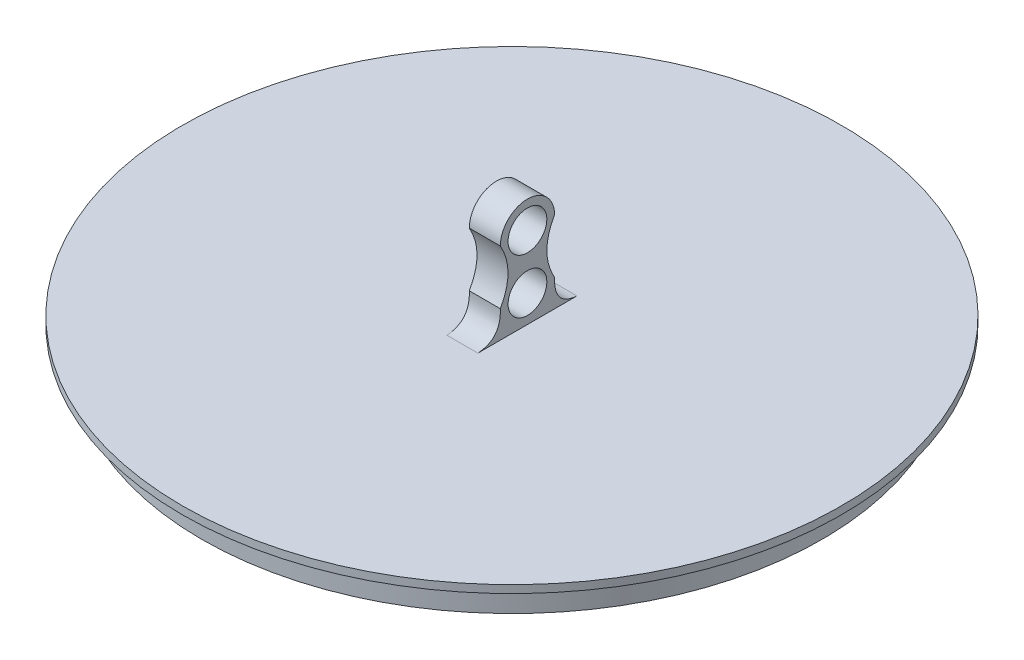
ISO-10303-21;
HEADER;
FILE_DESCRIPTION(('STEP AP214'),'2;1');
FILE_NAME('part.step','',(''),(''),'','','');
FILE_SCHEMA(('AUTOMOTIVE_DESIGN { 1 0 10303 214 1 1 1 1 }'));
ENDSEC;
DATA;
#1=APPLICATION_CONTEXT('core data for automotive mechanical design processes');
#2=APPLICATION_PROTOCOL_DEFINITION('international standard','automotive_design',2000,#1);
#3=PRODUCT_CONTEXT('',#1,'mechanical');
#4=PRODUCT('Part','Part','',(#3));
#5=PRODUCT_RELATED_PRODUCT_CATEGORY('part','',(#4));
#6=PRODUCT_DEFINITION_FORMATION('','',#4);
#7=PRODUCT_DEFINITION_CONTEXT('part definition',#1,'design');
#8=PRODUCT_DEFINITION('design','',#6,#7);
#9=PRODUCT_DEFINITION_SHAPE('','',#8);
#10=(LENGTH_UNIT() NAMED_UNIT(*) SI_UNIT(.MILLI.,.METRE.));
#11=(NAMED_UNIT(*) PLANE_ANGLE_UNIT() SI_UNIT($,.RADIAN.));
#12=(NAMED_UNIT(*) SI_UNIT($,.STERADIAN.) SOLID_ANGLE_UNIT());
#13=UNCERTAINTY_MEASURE_WITH_UNIT(LENGTH_MEASURE(1.E-05),#10,'distance_accuracy_value','');
#14=(GEOMETRIC_REPRESENTATION_CONTEXT(3) GLOBAL_UNCERTAINTY_ASSIGNED_CONTEXT((#13)) GLOBAL_UNIT_ASSIGNED_CONTEXT((#10,
#11,#12)) REPRESENTATION_CONTEXT('',''));
#15=CARTESIAN_POINT('',(0.,0.,0.));
#16=DIRECTION('',(0.,0.,1.));
#17=DIRECTION('',(1.,0.,0.));
#18=AXIS2_PLACEMENT_3D('',#15,#16,#17);
#19=CARTESIAN_POINT('',(0.,5.,0.));
#20=DIRECTION('',(0.,1.,0.));
#21=DIRECTION('',(0.,0.,1.));
#22=AXIS2_PLACEMENT_3D('',#19,#20,#21);
#23=PLANE('',#22);
#24=CARTESIAN_POINT('',(0.,5.,0.));
#25=DIRECTION('',(0.,1.,0.));
#26=DIRECTION('',(0.,0.,1.));
#27=AXIS2_PLACEMENT_3D('',#24,#25,#26);
#28=CIRCLE('',#27,42.5);
#29=CARTESIAN_POINT('',(0.,5.,42.5));
#30=VERTEX_POINT('',#29);
#31=EDGE_CURVE('E190',#30,#30,#28,.T.);
#32=ORIENTED_EDGE('',*,*,#31,.T.);
#33=EDGE_LOOP('',(#32));
#34=FACE_BOUND('',#33,.T.);
#35=DIRECTION('',(1.,0.,0.));
#36=VECTOR('',#35,1.);
#37=CARTESIAN_POINT('',(-2.,5.,6.38998179076283));
#38=LINE('',#37,#36);
#39=CARTESIAN_POINT('',(-2.,5.,6.38998179076284));
#40=VERTEX_POINT('',#39);
#41=CARTESIAN_POINT('',(2.,5.,6.38998179076283));
#42=VERTEX_POINT('',#41);
#43=EDGE_CURVE('E61',#40,#42,#38,.T.);
#44=ORIENTED_EDGE('',*,*,#43,.F.);
#45=DIRECTION('',(0.,0.,-1.));
#46=VECTOR('',#45,1.);
#47=CARTESIAN_POINT('',(-2.,5.,0.));
#48=LINE('',#47,#46);
#49=CARTESIAN_POINT('',(-2.,5.,-6.38998179076286));
#50=VERTEX_POINT('',#49);
#51=EDGE_CURVE('E56',#40,#50,#48,.T.);
#52=ORIENTED_EDGE('',*,*,#51,.T.);
#53=DIRECTION('',(1.,0.,0.));
#54=VECTOR('',#53,1.);
#55=CARTESIAN_POINT('',(-2.,5.,-6.38998179076281));
#56=LINE('',#55,#54);
#57=CARTESIAN_POINT('',(2.,5.,-6.38998179076281));
#58=VERTEX_POINT('',#57);
#59=EDGE_CURVE('E203',#50,#58,#56,.T.);
#60=ORIENTED_EDGE('',*,*,#59,.T.);
#61=DIRECTION('',(0.,0.,-1.));
#62=VECTOR('',#61,1.);
#63=CARTESIAN_POINT('',(2.,5.,0.));
#64=LINE('',#63,#62);
#65=EDGE_CURVE('E138',#42,#58,#64,.T.);
#66=ORIENTED_EDGE('',*,*,#65,.F.);
#67=EDGE_LOOP('',(#44,#52,#60,#66));
#68=FACE_BOUND('',#67,.T.);
#69=ADVANCED_FACE('F41',(#34,#68),#23,.T.);
#70=CARTESIAN_POINT('',(0.,4.,0.));
#71=DIRECTION('',(0.,-1.,0.));
#72=DIRECTION('',(0.,0.,-1.));
#73=AXIS2_PLACEMENT_3D('',#70,#71,#72);
#74=CYLINDRICAL_SURFACE('',#73,40.);
#75=CARTESIAN_POINT('',(0.,4.,0.));
#76=DIRECTION('',(0.,1.,0.));
#77=DIRECTION('',(0.,0.,1.));
#78=AXIS2_PLACEMENT_3D('',#75,#76,#77);
#79=CIRCLE('',#78,40.);
#80=CARTESIAN_POINT('',(0.,4.,40.));
#81=VERTEX_POINT('',#80);
#82=EDGE_CURVE('E11',#81,#81,#79,.T.);
#83=ORIENTED_EDGE('',*,*,#82,.F.);
#84=EDGE_LOOP('',(#83));
#85=FACE_BOUND('',#84,.T.);
#86=CARTESIAN_POINT('',(0.,0.,0.));
#87=DIRECTION('',(0.,1.,0.));
#88=DIRECTION('',(0.,0.,1.));
#89=AXIS2_PLACEMENT_3D('',#86,#87,#88);
#90=CIRCLE('',#89,40.);
#91=CARTESIAN_POINT('',(0.,0.,40.));
#92=VERTEX_POINT('',#91);
#93=EDGE_CURVE('E45',#92,#92,#90,.T.);
#94=ORIENTED_EDGE('',*,*,#93,.T.);
#95=EDGE_LOOP('',(#94));
#96=FACE_BOUND('',#95,.T.);
#97=ADVANCED_FACE('F43',(#85,#96),#74,.T.);
#98=CARTESIAN_POINT('',(0.,0.,0.));
#99=DIRECTION('',(0.,1.,0.));
#100=DIRECTION('',(0.,0.,1.));
#101=AXIS2_PLACEMENT_3D('',#98,#99,#100);
#102=PLANE('',#101);
#103=ORIENTED_EDGE('',*,*,#93,.F.);
#104=EDGE_LOOP('',(#103));
#105=FACE_BOUND('',#104,.T.);
#106=ADVANCED_FACE('F179',(#105),#102,.F.);
#107=CARTESIAN_POINT('',(0.,5.,0.));
#108=DIRECTION('',(0.,-1.,0.));
#109=DIRECTION('',(0.,0.,-1.));
#110=AXIS2_PLACEMENT_3D('',#107,#108,#109);
#111=CYLINDRICAL_SURFACE('',#110,42.5);
#112=ORIENTED_EDGE('',*,*,#31,.F.);
#113=EDGE_LOOP('',(#112));
#114=FACE_BOUND('',#113,.T.);
#115=CARTESIAN_POINT('',(0.,4.,0.));
#116=DIRECTION('',(0.,1.,0.));
#117=DIRECTION('',(0.,0.,1.));
#118=AXIS2_PLACEMENT_3D('',#115,#116,#117);
#119=CIRCLE('',#118,42.5);
#120=CARTESIAN_POINT('',(0.,4.,42.5));
#121=VERTEX_POINT('',#120);
#122=EDGE_CURVE('E192',#121,#121,#119,.T.);
#123=ORIENTED_EDGE('',*,*,#122,.T.);
#124=EDGE_LOOP('',(#123));
#125=FACE_BOUND('',#124,.T.);
#126=ADVANCED_FACE('F176',(#114,#125),#111,.T.);
#127=CARTESIAN_POINT('',(0.,4.,0.));
#128=DIRECTION('',(0.,1.,0.));
#129=DIRECTION('',(0.,0.,1.));
#130=AXIS2_PLACEMENT_3D('',#127,#128,#129);
#131=PLANE('',#130);
#132=ORIENTED_EDGE('',*,*,#82,.T.);
#133=EDGE_LOOP('',(#132));
#134=FACE_BOUND('',#133,.T.);
#135=ORIENTED_EDGE('',*,*,#122,.F.);
#136=EDGE_LOOP('',(#135));
#137=FACE_BOUND('',#136,.T.);
#138=ADVANCED_FACE('F169',(#134,#137),#131,.F.);
#139=CARTESIAN_POINT('',(-2.,15.5178235552553,-3.5));
#140=CARTESIAN_POINT('',(-2.,12.0178235552553,-1.51067425348564));
#141=CARTESIAN_POINT('',(-2.,8.51782355525532,-3.5));
#142=B_SPLINE_CURVE_WITH_KNOTS('',2,(#139,#140,#141),.UNSPECIFIED.,.F.,.F.,(3,3),(0.,1.),.UNSPECIFIED.);
#143=DIRECTION('',(1.,0.,0.));
#144=VECTOR('',#143,1.);
#145=SURFACE_OF_LINEAR_EXTRUSION('',#142,#144);
#146=DIRECTION('',(1.,0.,0.));
#147=VECTOR('',#146,1.);
#148=CARTESIAN_POINT('',(-2.,15.5178235552553,-3.5));
#149=LINE('',#148,#147);
#150=CARTESIAN_POINT('',(-2.,15.5178235552553,-3.5));
#151=VERTEX_POINT('',#150);
#152=CARTESIAN_POINT('',(2.,15.5178235552553,-3.5));
#153=VERTEX_POINT('',#152);
#154=EDGE_CURVE('E92',#151,#153,#149,.T.);
#155=ORIENTED_EDGE('',*,*,#154,.T.);
#156=CARTESIAN_POINT('',(2.,15.5178235552553,-3.5));
#157=CARTESIAN_POINT('',(2.,12.0178235552553,-1.51067425348564));
#158=CARTESIAN_POINT('',(2.,8.51782355525532,-3.5));
#159=B_SPLINE_CURVE_WITH_KNOTS('',2,(#156,#157,#158),.UNSPECIFIED.,.F.,.F.,(3,3),(0.,1.),.UNSPECIFIED.);
#160=CARTESIAN_POINT('',(2.,8.51782355525532,-3.5));
#161=VERTEX_POINT('',#160);
#162=EDGE_CURVE('E97',#153,#161,#159,.T.);
#163=ORIENTED_EDGE('',*,*,#162,.T.);
#164=DIRECTION('',(1.,0.,0.));
#165=VECTOR('',#164,1.);
#166=CARTESIAN_POINT('',(-2.,8.51782355525532,-3.5));
#167=LINE('',#166,#165);
#168=CARTESIAN_POINT('',(-2.,8.51782355525532,-3.5));
#169=VERTEX_POINT('',#168);
#170=EDGE_CURVE('E196',#169,#161,#167,.T.);
#171=ORIENTED_EDGE('',*,*,#170,.F.);
#172=EDGE_CURVE('E100',#151,#169,#142,.T.);
#173=ORIENTED_EDGE('',*,*,#172,.F.);
#174=EDGE_LOOP('',(#155,#163,#171,#173));
#175=FACE_BOUND('',#174,.T.);
#176=ADVANCED_FACE('F94',(#175),#145,.F.);
#177=CARTESIAN_POINT('',(-2.,8.51782355525532,-3.5));
#178=CARTESIAN_POINT('',(-2.,4.73416780338102,-3.32767527609279));
#179=CARTESIAN_POINT('',(-2.,5.,-7.38163381334149));
#180=B_SPLINE_CURVE_WITH_KNOTS('',2,(#177,#178,#179),.UNSPECIFIED.,.F.,.F.,(3,3),(0.,1.),.UNSPECIFIED.);
#181=DIRECTION('',(1.,0.,0.));
#182=VECTOR('',#181,1.);
#183=SURFACE_OF_LINEAR_EXTRUSION('',#180,#182);
#184=ORIENTED_EDGE('',*,*,#170,.T.);
#185=CARTESIAN_POINT('',(2.,8.51782355525532,-3.5));
#186=CARTESIAN_POINT('',(2.,4.73416780338102,-3.32767527609279));
#187=CARTESIAN_POINT('',(2.,5.,-7.38163381334149));
#188=B_SPLINE_CURVE_WITH_KNOTS('',2,(#185,#186,#187),.UNSPECIFIED.,.F.,.F.,(3,3),(0.,1.),.UNSPECIFIED.);
#189=EDGE_CURVE('E119',#161,#58,#188,.T.);
#190=ORIENTED_EDGE('',*,*,#189,.T.);
#191=ORIENTED_EDGE('',*,*,#59,.F.);
#192=EDGE_CURVE('E211',#169,#50,#180,.T.);
#193=ORIENTED_EDGE('',*,*,#192,.F.);
#194=EDGE_LOOP('',(#184,#190,#191,#193));
#195=FACE_BOUND('',#194,.T.);
#196=ADVANCED_FACE('F168',(#195),#183,.F.);
#197=CARTESIAN_POINT('',(-2.,8.51782355525532,3.5));
#198=CARTESIAN_POINT('',(-2.,4.73416780338102,3.32767527609279));
#199=CARTESIAN_POINT('',(-2.,5.,7.38163381334149));
#200=B_SPLINE_CURVE_WITH_KNOTS('',2,(#197,#198,#199),.UNSPECIFIED.,.F.,.F.,(3,3),(0.,1.),.UNSPECIFIED.);
#201=DIRECTION('',(1.,0.,0.));
#202=VECTOR('',#201,1.);
#203=SURFACE_OF_LINEAR_EXTRUSION('',#200,#202);
#204=ORIENTED_EDGE('',*,*,#43,.T.);
#205=CARTESIAN_POINT('',(2.,8.51782355525532,3.5));
#206=CARTESIAN_POINT('',(2.,4.73416780338102,3.32767527609279));
#207=CARTESIAN_POINT('',(2.,5.,7.38163381334149));
#208=B_SPLINE_CURVE_WITH_KNOTS('',2,(#205,#206,#207),.UNSPECIFIED.,.F.,.F.,(3,3),(0.,1.),.UNSPECIFIED.);
#209=CARTESIAN_POINT('',(2.,8.51782355525532,3.5));
#210=VERTEX_POINT('',#209);
#211=EDGE_CURVE('E130',#210,#42,#208,.T.);
#212=ORIENTED_EDGE('',*,*,#211,.F.);
#213=DIRECTION('',(1.,0.,0.));
#214=VECTOR('',#213,1.);
#215=CARTESIAN_POINT('',(-2.,8.51782355525532,3.5));
#216=LINE('',#215,#214);
#217=CARTESIAN_POINT('',(-2.,8.51782355525532,3.5));
#218=VERTEX_POINT('',#217);
#219=EDGE_CURVE('E200',#218,#210,#216,.T.);
#220=ORIENTED_EDGE('',*,*,#219,.F.);
#221=EDGE_CURVE('E231',#218,#40,#200,.T.);
#222=ORIENTED_EDGE('',*,*,#221,.T.);
#223=EDGE_LOOP('',(#204,#212,#220,#222));
#224=FACE_BOUND('',#223,.T.);
#225=ADVANCED_FACE('F224',(#224),#203,.T.);
#226=CARTESIAN_POINT('',(-2.,15.5178235552553,3.5));
#227=CARTESIAN_POINT('',(-2.,12.0178235552553,1.51067425348564));
#228=CARTESIAN_POINT('',(-2.,8.51782355525532,3.5));
#229=B_SPLINE_CURVE_WITH_KNOTS('',2,(#226,#227,#228),.UNSPECIFIED.,.F.,.F.,(3,3),(0.,1.),.UNSPECIFIED.);
#230=DIRECTION('',(1.,0.,0.));
#231=VECTOR('',#230,1.);
#232=SURFACE_OF_LINEAR_EXTRUSION('',#229,#231);
#233=ORIENTED_EDGE('',*,*,#219,.T.);
#234=CARTESIAN_POINT('',(2.,15.5178235552553,3.5));
#235=CARTESIAN_POINT('',(2.,12.0178235552553,1.51067425348564));
#236=CARTESIAN_POINT('',(2.,8.51782355525532,3.5));
#237=B_SPLINE_CURVE_WITH_KNOTS('',2,(#234,#235,#236),.UNSPECIFIED.,.F.,.F.,(3,3),(0.,1.),.UNSPECIFIED.);
#238=CARTESIAN_POINT('',(2.,15.5178235552553,3.5));
#239=VERTEX_POINT('',#238);
#240=EDGE_CURVE('E113',#239,#210,#237,.T.);
#241=ORIENTED_EDGE('',*,*,#240,.F.);
#242=DIRECTION('',(1.,0.,0.));
#243=VECTOR('',#242,1.);
#244=CARTESIAN_POINT('',(-2.,15.5178235552553,3.5));
#245=LINE('',#244,#243);
#246=CARTESIAN_POINT('',(-2.,15.5178235552553,3.5));
#247=VERTEX_POINT('',#246);
#248=EDGE_CURVE('E104',#247,#239,#245,.T.);
#249=ORIENTED_EDGE('',*,*,#248,.F.);
#250=EDGE_CURVE('E236',#247,#218,#229,.T.);
#251=ORIENTED_EDGE('',*,*,#250,.T.);
#252=EDGE_LOOP('',(#233,#241,#249,#251));
#253=FACE_BOUND('',#252,.T.);
#254=ADVANCED_FACE('F229',(#253),#232,.T.);
#255=CARTESIAN_POINT('',(-2.,8.51782355525532,0.));
#256=DIRECTION('',(1.,0.,0.));
#257=DIRECTION('',(0.,0.,-1.));
#258=AXIS2_PLACEMENT_3D('',#255,#256,#257);
#259=CYLINDRICAL_SURFACE('',#258,2.5);
#260=CARTESIAN_POINT('',(-2.,8.51782355525532,0.));
#261=DIRECTION('',(1.,0.,0.));
#262=DIRECTION('',(0.,0.,-1.));
#263=AXIS2_PLACEMENT_3D('',#260,#261,#262);
#264=CIRCLE('',#263,2.5);
#265=CARTESIAN_POINT('',(-2.,8.51782355525532,-2.5));
#266=VERTEX_POINT('',#265);
#267=EDGE_CURVE('E208',#266,#266,#264,.T.);
#268=ORIENTED_EDGE('',*,*,#267,.F.);
#269=EDGE_LOOP('',(#268));
#270=FACE_BOUND('',#269,.T.);
#271=CARTESIAN_POINT('',(2.,8.51782355525532,0.));
#272=DIRECTION('',(1.,0.,0.));
#273=DIRECTION('',(0.,0.,-1.));
#274=AXIS2_PLACEMENT_3D('',#271,#272,#273);
#275=CIRCLE('',#274,2.5);
#276=CARTESIAN_POINT('',(2.,8.51782355525532,-2.5));
#277=VERTEX_POINT('',#276);
#278=EDGE_CURVE('E146',#277,#277,#275,.T.);
#279=ORIENTED_EDGE('',*,*,#278,.T.);
#280=EDGE_LOOP('',(#279));
#281=FACE_BOUND('',#280,.T.);
#282=ADVANCED_FACE('F226',(#270,#281),#259,.F.);
#283=CARTESIAN_POINT('',(-2.,15.5178235552553,0.));
#284=DIRECTION('',(1.,0.,0.));
#285=DIRECTION('',(0.,0.,-1.));
#286=AXIS2_PLACEMENT_3D('',#283,#284,#285);
#287=CYLINDRICAL_SURFACE('',#286,3.5);
#288=ORIENTED_EDGE('',*,*,#248,.T.);
#289=CARTESIAN_POINT('',(2.,15.5178235552553,0.));
#290=DIRECTION('',(1.,0.,0.));
#291=DIRECTION('',(0.,0.,-1.));
#292=AXIS2_PLACEMENT_3D('',#289,#290,#291);
#293=CIRCLE('',#292,3.5);
#294=EDGE_CURVE('E108',#153,#239,#293,.T.);
#295=ORIENTED_EDGE('',*,*,#294,.F.);
#296=ORIENTED_EDGE('',*,*,#154,.F.);
#297=CARTESIAN_POINT('',(-2.,15.5178235552553,0.));
#298=DIRECTION('',(1.,0.,0.));
#299=DIRECTION('',(0.,0.,-1.));
#300=AXIS2_PLACEMENT_3D('',#297,#298,#299);
#301=CIRCLE('',#300,3.5);
#302=EDGE_CURVE('E159',#151,#247,#301,.T.);
#303=ORIENTED_EDGE('',*,*,#302,.T.);
#304=EDGE_LOOP('',(#288,#295,#296,#303));
#305=FACE_BOUND('',#304,.T.);
#306=ADVANCED_FACE('F109',(#305),#287,.T.);
#307=CARTESIAN_POINT('',(-2.,15.5178235552553,0.));
#308=DIRECTION('',(1.,0.,0.));
#309=DIRECTION('',(0.,0.,-1.));
#310=AXIS2_PLACEMENT_3D('',#307,#308,#309);
#311=CYLINDRICAL_SURFACE('',#310,2.5);
#312=CARTESIAN_POINT('',(-2.,15.5178235552553,0.));
#313=DIRECTION('',(1.,0.,0.));
#314=DIRECTION('',(0.,0.,-1.));
#315=AXIS2_PLACEMENT_3D('',#312,#313,#314);
#316=CIRCLE('',#315,2.5);
#317=CARTESIAN_POINT('',(-2.,15.5178235552553,-2.5));
#318=VERTEX_POINT('',#317);
#319=EDGE_CURVE('E105',#318,#318,#316,.T.);
#320=ORIENTED_EDGE('',*,*,#319,.F.);
#321=EDGE_LOOP('',(#320));
#322=FACE_BOUND('',#321,.T.);
#323=CARTESIAN_POINT('',(2.,15.5178235552553,0.));
#324=DIRECTION('',(1.,0.,0.));
#325=DIRECTION('',(0.,0.,-1.));
#326=AXIS2_PLACEMENT_3D('',#323,#324,#325);
#327=CIRCLE('',#326,2.5);
#328=CARTESIAN_POINT('',(2.,15.5178235552553,-2.5));
#329=VERTEX_POINT('',#328);
#330=EDGE_CURVE('E152',#329,#329,#327,.T.);
#331=ORIENTED_EDGE('',*,*,#330,.T.);
#332=EDGE_LOOP('',(#331));
#333=FACE_BOUND('',#332,.T.);
#334=ADVANCED_FACE('F263',(#322,#333),#311,.F.);
#335=CARTESIAN_POINT('',(-2.,0.,0.));
#336=DIRECTION('',(1.,0.,0.));
#337=DIRECTION('',(0.,0.,-1.));
#338=AXIS2_PLACEMENT_3D('',#335,#336,#337);
#339=PLANE('',#338);
#340=ORIENTED_EDGE('',*,*,#172,.T.);
#341=ORIENTED_EDGE('',*,*,#192,.T.);
#342=ORIENTED_EDGE('',*,*,#51,.F.);
#343=ORIENTED_EDGE('',*,*,#221,.F.);
#344=ORIENTED_EDGE('',*,*,#250,.F.);
#345=ORIENTED_EDGE('',*,*,#302,.F.);
#346=EDGE_LOOP('',(#340,#341,#342,#343,#344,#345));
#347=FACE_BOUND('',#346,.T.);
#348=ORIENTED_EDGE('',*,*,#267,.T.);
#349=EDGE_LOOP('',(#348));
#350=FACE_BOUND('',#349,.T.);
#351=ORIENTED_EDGE('',*,*,#319,.T.);
#352=EDGE_LOOP('',(#351));
#353=FACE_BOUND('',#352,.T.);
#354=ADVANCED_FACE('F250',(#347,#350,#353),#339,.F.);
#355=CARTESIAN_POINT('',(2.,0.,0.));
#356=DIRECTION('',(1.,0.,0.));
#357=DIRECTION('',(0.,0.,-1.));
#358=AXIS2_PLACEMENT_3D('',#355,#356,#357);
#359=PLANE('',#358);
#360=ORIENTED_EDGE('',*,*,#162,.F.);
#361=ORIENTED_EDGE('',*,*,#294,.T.);
#362=ORIENTED_EDGE('',*,*,#240,.T.);
#363=ORIENTED_EDGE('',*,*,#211,.T.);
#364=ORIENTED_EDGE('',*,*,#65,.T.);
#365=ORIENTED_EDGE('',*,*,#189,.F.);
#366=EDGE_LOOP('',(#360,#361,#362,#363,#364,#365));
#367=FACE_BOUND('',#366,.T.);
#368=ORIENTED_EDGE('',*,*,#278,.F.);
#369=EDGE_LOOP('',(#368));
#370=FACE_BOUND('',#369,.T.);
#371=ORIENTED_EDGE('',*,*,#330,.F.);
#372=EDGE_LOOP('',(#371));
#373=FACE_BOUND('',#372,.T.);
#374=ADVANCED_FACE('F115',(#367,#370,#373),#359,.T.);
#375=CLOSED_SHELL('',(#69,#97,#106,#126,#138,#176,#196,#225,#254,#282,#306,#334,#354,#374));
#376=MANIFOLD_SOLID_BREP('B2',#375);
#377=ADVANCED_BREP_SHAPE_REPRESENTATION('',(#18,#376),#14);
#378=SHAPE_DEFINITION_REPRESENTATION(#9,#377);
ENDSEC;
END-ISO-10303-21;
